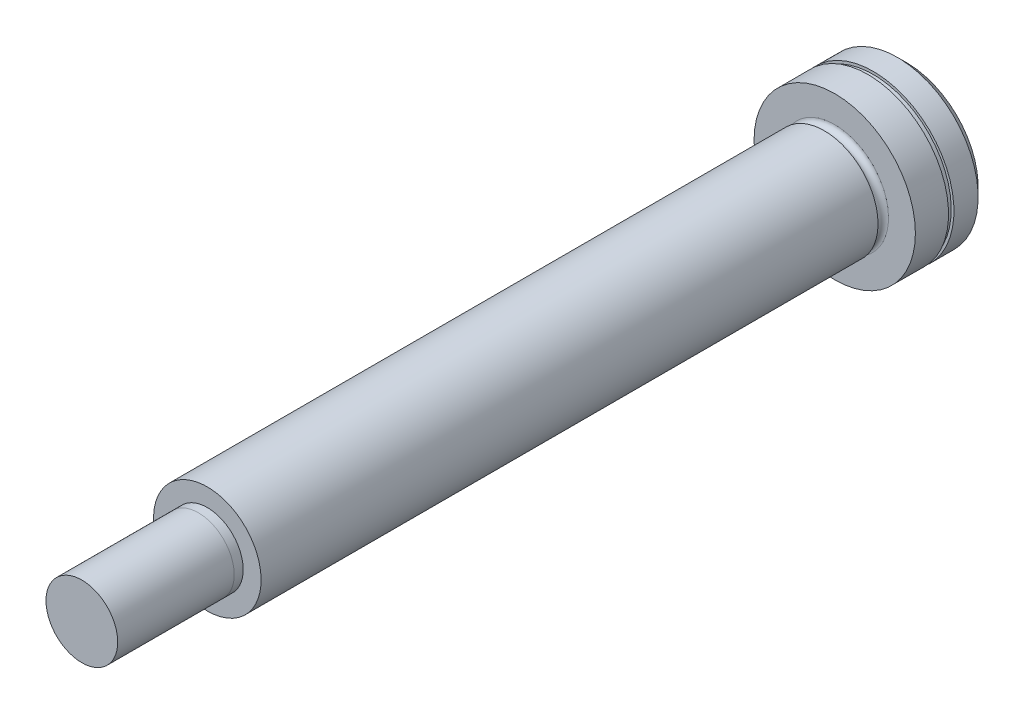
ISO-10303-21;
HEADER;
FILE_DESCRIPTION(('STEP AP214'),'2;1');
FILE_NAME('part.step','',(''),(''),'','','');
FILE_SCHEMA(('AUTOMOTIVE_DESIGN { 1 0 10303 214 1 1 1 1 }'));
ENDSEC;
DATA;
#1=APPLICATION_CONTEXT('core data for automotive mechanical design processes');
#2=APPLICATION_PROTOCOL_DEFINITION('international standard','automotive_design',2000,#1);
#3=PRODUCT_CONTEXT('',#1,'mechanical');
#4=PRODUCT('Part','Part','',(#3));
#5=PRODUCT_RELATED_PRODUCT_CATEGORY('part','',(#4));
#6=PRODUCT_DEFINITION_FORMATION('','',#4);
#7=PRODUCT_DEFINITION_CONTEXT('part definition',#1,'design');
#8=PRODUCT_DEFINITION('design','',#6,#7);
#9=PRODUCT_DEFINITION_SHAPE('','',#8);
#10=(LENGTH_UNIT() NAMED_UNIT(*) SI_UNIT(.MILLI.,.METRE.));
#11=(NAMED_UNIT(*) PLANE_ANGLE_UNIT() SI_UNIT($,.RADIAN.));
#12=(NAMED_UNIT(*) SI_UNIT($,.STERADIAN.) SOLID_ANGLE_UNIT());
#13=UNCERTAINTY_MEASURE_WITH_UNIT(LENGTH_MEASURE(1.E-05),#10,'distance_accuracy_value','');
#14=(GEOMETRIC_REPRESENTATION_CONTEXT(3) GLOBAL_UNCERTAINTY_ASSIGNED_CONTEXT((#13)) GLOBAL_UNIT_ASSIGNED_CONTEXT((#10,
#11,#12)) REPRESENTATION_CONTEXT('',''));
#15=CARTESIAN_POINT('',(0.,0.,0.));
#16=DIRECTION('',(0.,0.,1.));
#17=DIRECTION('',(1.,0.,0.));
#18=AXIS2_PLACEMENT_3D('',#15,#16,#17);
#19=CARTESIAN_POINT('',(0.,0.,0.));
#20=DIRECTION('',(0.,0.,1.));
#21=DIRECTION('',(1.,0.,0.));
#22=AXIS2_PLACEMENT_3D('',#19,#20,#21);
#23=CONICAL_SURFACE('',#22,4.,0.785398163397449);
#24=CARTESIAN_POINT('',(0.,0.,0.));
#25=DIRECTION('',(0.,0.,-1.));
#26=DIRECTION('',(-1.,0.,0.));
#27=AXIS2_PLACEMENT_3D('',#24,#25,#26);
#28=CIRCLE('',#27,4.);
#29=CARTESIAN_POINT('',(-4.,0.,0.));
#30=VERTEX_POINT('',#29);
#31=EDGE_CURVE('E19',#30,#30,#28,.T.);
#32=ORIENTED_EDGE('',*,*,#31,.F.);
#33=EDGE_LOOP('',(#32));
#34=FACE_BOUND('',#33,.T.);
#35=CARTESIAN_POINT('',(0.,0.,0.5));
#36=DIRECTION('',(0.,0.,1.));
#37=DIRECTION('',(-1.,0.,0.));
#38=AXIS2_PLACEMENT_3D('',#35,#36,#37);
#39=CIRCLE('',#38,4.5);
#40=CARTESIAN_POINT('',(-4.5,0.,0.5));
#41=VERTEX_POINT('',#40);
#42=EDGE_CURVE('E10',#41,#41,#39,.T.);
#43=ORIENTED_EDGE('',*,*,#42,.F.);
#44=EDGE_LOOP('',(#43));
#45=FACE_BOUND('',#44,.T.);
#46=ADVANCED_FACE('F15',(#34,#45),#23,.T.);
#47=CARTESIAN_POINT('',(0.,0.,4.));
#48=DIRECTION('',(0.,0.,-1.));
#49=DIRECTION('',(-1.,0.,0.));
#50=AXIS2_PLACEMENT_3D('',#47,#48,#49);
#51=CYLINDRICAL_SURFACE('',#50,4.5);
#52=CARTESIAN_POINT('',(0.,0.,1.85));
#53=DIRECTION('',(0.,0.,1.));
#54=DIRECTION('',(-1.,0.,0.));
#55=AXIS2_PLACEMENT_3D('',#52,#53,#54);
#56=CIRCLE('',#55,4.5);
#57=CARTESIAN_POINT('',(-4.5,0.,1.85));
#58=VERTEX_POINT('',#57);
#59=EDGE_CURVE('E208',#58,#58,#56,.T.);
#60=ORIENTED_EDGE('',*,*,#59,.F.);
#61=EDGE_LOOP('',(#60));
#62=FACE_BOUND('',#61,.T.);
#63=ORIENTED_EDGE('',*,*,#42,.T.);
#64=EDGE_LOOP('',(#63));
#65=FACE_BOUND('',#64,.T.);
#66=ADVANCED_FACE('F325',(#62,#65),#51,.T.);
#67=CARTESIAN_POINT('',(0.,0.,0.));
#68=DIRECTION('',(0.,0.,-1.));
#69=DIRECTION('',(0.,-1.,0.));
#70=AXIS2_PLACEMENT_3D('',#67,#68,#69);
#71=PLANE('',#70);
#72=DIRECTION('',(1.,0.,0.));
#73=VECTOR('',#72,1.);
#74=CARTESIAN_POINT('',(-0.866025403784437,1.5,0.));
#75=LINE('',#74,#73);
#76=CARTESIAN_POINT('',(-0.866025403784437,1.5,0.));
#77=VERTEX_POINT('',#76);
#78=CARTESIAN_POINT('',(0.866025403784438,1.5,0.));
#79=VERTEX_POINT('',#78);
#80=EDGE_CURVE('E260',#77,#79,#75,.T.);
#81=ORIENTED_EDGE('',*,*,#80,.F.);
#82=DIRECTION('',(0.5,0.866025403784438,0.));
#83=VECTOR('',#82,1.);
#84=CARTESIAN_POINT('',(-1.73205080756888,0.,0.));
#85=LINE('',#84,#83);
#86=CARTESIAN_POINT('',(-1.73205080756888,0.,0.));
#87=VERTEX_POINT('',#86);
#88=EDGE_CURVE('E225',#87,#77,#85,.T.);
#89=ORIENTED_EDGE('',*,*,#88,.F.);
#90=DIRECTION('',(-0.5,0.86602540378444,0.));
#91=VECTOR('',#90,1.);
#92=CARTESIAN_POINT('',(-0.866025403784441,-1.5,0.));
#93=LINE('',#92,#91);
#94=CARTESIAN_POINT('',(-0.866025403784441,-1.5,0.));
#95=VERTEX_POINT('',#94);
#96=EDGE_CURVE('E136',#95,#87,#93,.T.);
#97=ORIENTED_EDGE('',*,*,#96,.F.);
#98=DIRECTION('',(-1.,0.,0.));
#99=VECTOR('',#98,1.);
#100=CARTESIAN_POINT('',(0.866025403784438,-1.5,0.));
#101=LINE('',#100,#99);
#102=CARTESIAN_POINT('',(0.866025403784437,-1.5,0.));
#103=VERTEX_POINT('',#102);
#104=EDGE_CURVE('E126',#103,#95,#101,.T.);
#105=ORIENTED_EDGE('',*,*,#104,.F.);
#106=DIRECTION('',(-0.5,-0.866025403784439,0.));
#107=VECTOR('',#106,1.);
#108=CARTESIAN_POINT('',(1.73205080756888,0.,0.));
#109=LINE('',#108,#107);
#110=CARTESIAN_POINT('',(1.73205080756888,0.,0.));
#111=VERTEX_POINT('',#110);
#112=EDGE_CURVE('E132',#111,#103,#109,.T.);
#113=ORIENTED_EDGE('',*,*,#112,.F.);
#114=DIRECTION('',(0.5,-0.866025403784439,0.));
#115=VECTOR('',#114,1.);
#116=CARTESIAN_POINT('',(0.866025403784438,1.5,0.));
#117=LINE('',#116,#115);
#118=EDGE_CURVE('E177',#79,#111,#117,.T.);
#119=ORIENTED_EDGE('',*,*,#118,.F.);
#120=EDGE_LOOP('',(#81,#89,#97,#105,#113,#119));
#121=FACE_BOUND('',#120,.T.);
#122=ORIENTED_EDGE('',*,*,#31,.T.);
#123=EDGE_LOOP('',(#122));
#124=FACE_BOUND('',#123,.T.);
#125=ADVANCED_FACE('F128',(#121,#124),#71,.T.);
#126=CARTESIAN_POINT('',(-0.866025403784437,1.5,2.));
#127=DIRECTION('',(0.,1.,0.));
#128=DIRECTION('',(1.,0.,0.));
#129=AXIS2_PLACEMENT_3D('',#126,#127,#128);
#130=PLANE('',#129);
#131=ORIENTED_EDGE('',*,*,#80,.T.);
#132=DIRECTION('',(0.,0.,-1.));
#133=VECTOR('',#132,1.);
#134=CARTESIAN_POINT('',(0.866025403784438,1.5,2.));
#135=LINE('',#134,#133);
#136=CARTESIAN_POINT('',(0.866025403784438,1.5,2.));
#137=VERTEX_POINT('',#136);
#138=EDGE_CURVE('E159',#137,#79,#135,.T.);
#139=ORIENTED_EDGE('',*,*,#138,.F.);
#140=DIRECTION('',(1.,0.,0.));
#141=VECTOR('',#140,1.);
#142=CARTESIAN_POINT('',(-0.866025403784437,1.5,2.));
#143=LINE('',#142,#141);
#144=CARTESIAN_POINT('',(0.,1.5,2.));
#145=VERTEX_POINT('',#144);
#146=EDGE_CURVE('E171',#145,#137,#143,.T.);
#147=ORIENTED_EDGE('',*,*,#146,.F.);
#148=DIRECTION('',(1.,0.,0.));
#149=VECTOR('',#148,1.);
#150=CARTESIAN_POINT('',(-0.866025403784437,1.5,2.));
#151=LINE('',#150,#149);
#152=CARTESIAN_POINT('',(-0.866025403784437,1.5,2.));
#153=VERTEX_POINT('',#152);
#154=EDGE_CURVE('E175',#153,#145,#151,.T.);
#155=ORIENTED_EDGE('',*,*,#154,.F.);
#156=DIRECTION('',(0.,0.,-1.));
#157=VECTOR('',#156,1.);
#158=CARTESIAN_POINT('',(-0.866025403784437,1.5,2.));
#159=LINE('',#158,#157);
#160=EDGE_CURVE('E229',#153,#77,#159,.T.);
#161=ORIENTED_EDGE('',*,*,#160,.T.);
#162=EDGE_LOOP('',(#131,#139,#147,#155,#161));
#163=FACE_BOUND('',#162,.T.);
#164=ADVANCED_FACE('F352',(#163),#130,.F.);
#165=CARTESIAN_POINT('',(-1.73205080756888,0.,2.));
#166=DIRECTION('',(-0.866025403784438,0.5,0.));
#167=DIRECTION('',(0.,0.,1.));
#168=AXIS2_PLACEMENT_3D('',#165,#166,#167);
#169=PLANE('',#168);
#170=ORIENTED_EDGE('',*,*,#88,.T.);
#171=ORIENTED_EDGE('',*,*,#160,.F.);
#172=DIRECTION('',(0.5,0.866025403784438,0.));
#173=VECTOR('',#172,1.);
#174=CARTESIAN_POINT('',(-1.73205080756888,0.,2.));
#175=LINE('',#174,#173);
#176=CARTESIAN_POINT('',(-1.29903810567666,0.75,2.));
#177=VERTEX_POINT('',#176);
#178=EDGE_CURVE('E224',#177,#153,#175,.T.);
#179=ORIENTED_EDGE('',*,*,#178,.F.);
#180=DIRECTION('',(0.5,0.866025403784438,0.));
#181=VECTOR('',#180,1.);
#182=CARTESIAN_POINT('',(-1.73205080756888,0.,2.));
#183=LINE('',#182,#181);
#184=CARTESIAN_POINT('',(-1.73205080756888,0.,2.));
#185=VERTEX_POINT('',#184);
#186=EDGE_CURVE('E279',#185,#177,#183,.T.);
#187=ORIENTED_EDGE('',*,*,#186,.F.);
#188=DIRECTION('',(0.,0.,-1.));
#189=VECTOR('',#188,1.);
#190=CARTESIAN_POINT('',(-1.73205080756888,0.,2.));
#191=LINE('',#190,#189);
#192=EDGE_CURVE('E193',#185,#87,#191,.T.);
#193=ORIENTED_EDGE('',*,*,#192,.T.);
#194=EDGE_LOOP('',(#170,#171,#179,#187,#193));
#195=FACE_BOUND('',#194,.T.);
#196=ADVANCED_FACE('F345',(#195),#169,.F.);
#197=CARTESIAN_POINT('',(-0.866025403784441,-1.5,2.));
#198=DIRECTION('',(-0.86602540378444,-0.5,0.));
#199=DIRECTION('',(-0.5,0.86602540378444,0.));
#200=AXIS2_PLACEMENT_3D('',#197,#198,#199);
#201=PLANE('',#200);
#202=ORIENTED_EDGE('',*,*,#96,.T.);
#203=ORIENTED_EDGE('',*,*,#192,.F.);
#204=DIRECTION('',(-0.5,0.86602540378444,0.));
#205=VECTOR('',#204,1.);
#206=CARTESIAN_POINT('',(-0.866025403784441,-1.5,2.));
#207=LINE('',#206,#205);
#208=CARTESIAN_POINT('',(-1.29903810567666,-0.75,2.));
#209=VERTEX_POINT('',#208);
#210=EDGE_CURVE('E282',#209,#185,#207,.T.);
#211=ORIENTED_EDGE('',*,*,#210,.F.);
#212=DIRECTION('',(-0.5,0.86602540378444,0.));
#213=VECTOR('',#212,1.);
#214=CARTESIAN_POINT('',(-0.866025403784441,-1.5,2.));
#215=LINE('',#214,#213);
#216=CARTESIAN_POINT('',(-0.866025403784441,-1.5,2.));
#217=VERTEX_POINT('',#216);
#218=EDGE_CURVE('E169',#217,#209,#215,.T.);
#219=ORIENTED_EDGE('',*,*,#218,.F.);
#220=DIRECTION('',(0.,0.,-1.));
#221=VECTOR('',#220,1.);
#222=CARTESIAN_POINT('',(-0.866025403784441,-1.5,2.));
#223=LINE('',#222,#221);
#224=EDGE_CURVE('E140',#217,#95,#223,.T.);
#225=ORIENTED_EDGE('',*,*,#224,.T.);
#226=EDGE_LOOP('',(#202,#203,#211,#219,#225));
#227=FACE_BOUND('',#226,.T.);
#228=ADVANCED_FACE('F342',(#227),#201,.F.);
#229=CARTESIAN_POINT('',(0.866025403784438,-1.5,2.));
#230=DIRECTION('',(0.,-1.,0.));
#231=DIRECTION('',(-1.,0.,0.));
#232=AXIS2_PLACEMENT_3D('',#229,#230,#231);
#233=PLANE('',#232);
#234=ORIENTED_EDGE('',*,*,#104,.T.);
#235=ORIENTED_EDGE('',*,*,#224,.F.);
#236=DIRECTION('',(-1.,0.,0.));
#237=VECTOR('',#236,1.);
#238=CARTESIAN_POINT('',(0.866025403784438,-1.5,2.));
#239=LINE('',#238,#237);
#240=CARTESIAN_POINT('',(0.,-1.5,2.));
#241=VERTEX_POINT('',#240);
#242=EDGE_CURVE('E235',#241,#217,#239,.T.);
#243=ORIENTED_EDGE('',*,*,#242,.F.);
#244=DIRECTION('',(-1.,0.,0.));
#245=VECTOR('',#244,1.);
#246=CARTESIAN_POINT('',(0.866025403784438,-1.5,2.));
#247=LINE('',#246,#245);
#248=CARTESIAN_POINT('',(0.866025403784437,-1.5,2.));
#249=VERTEX_POINT('',#248);
#250=EDGE_CURVE('E148',#249,#241,#247,.T.);
#251=ORIENTED_EDGE('',*,*,#250,.F.);
#252=DIRECTION('',(0.,0.,-1.));
#253=VECTOR('',#252,1.);
#254=CARTESIAN_POINT('',(0.866025403784437,-1.5,2.));
#255=LINE('',#254,#253);
#256=EDGE_CURVE('E141',#249,#103,#255,.T.);
#257=ORIENTED_EDGE('',*,*,#256,.T.);
#258=EDGE_LOOP('',(#234,#235,#243,#251,#257));
#259=FACE_BOUND('',#258,.T.);
#260=ADVANCED_FACE('F145',(#259),#233,.F.);
#261=CARTESIAN_POINT('',(1.73205080756888,0.,2.));
#262=DIRECTION('',(0.866025403784439,-0.5,0.));
#263=DIRECTION('',(0.,0.,-1.));
#264=AXIS2_PLACEMENT_3D('',#261,#262,#263);
#265=PLANE('',#264);
#266=ORIENTED_EDGE('',*,*,#112,.T.);
#267=ORIENTED_EDGE('',*,*,#256,.F.);
#268=DIRECTION('',(-0.5,-0.866025403784439,0.));
#269=VECTOR('',#268,1.);
#270=CARTESIAN_POINT('',(1.73205080756888,0.,2.));
#271=LINE('',#270,#269);
#272=CARTESIAN_POINT('',(1.29903810567666,-0.75,2.));
#273=VERTEX_POINT('',#272);
#274=EDGE_CURVE('E218',#273,#249,#271,.T.);
#275=ORIENTED_EDGE('',*,*,#274,.F.);
#276=DIRECTION('',(-0.5,-0.866025403784439,0.));
#277=VECTOR('',#276,1.);
#278=CARTESIAN_POINT('',(1.73205080756888,0.,2.));
#279=LINE('',#278,#277);
#280=CARTESIAN_POINT('',(1.73205080756888,0.,2.));
#281=VERTEX_POINT('',#280);
#282=EDGE_CURVE('E187',#281,#273,#279,.T.);
#283=ORIENTED_EDGE('',*,*,#282,.F.);
#284=DIRECTION('',(0.,0.,-1.));
#285=VECTOR('',#284,1.);
#286=CARTESIAN_POINT('',(1.73205080756888,0.,2.));
#287=LINE('',#286,#285);
#288=EDGE_CURVE('E156',#281,#111,#287,.T.);
#289=ORIENTED_EDGE('',*,*,#288,.T.);
#290=EDGE_LOOP('',(#266,#267,#275,#283,#289));
#291=FACE_BOUND('',#290,.T.);
#292=ADVANCED_FACE('F154',(#291),#265,.F.);
#293=CARTESIAN_POINT('',(0.866025403784438,1.5,2.));
#294=DIRECTION('',(0.866025403784439,0.5,0.));
#295=DIRECTION('',(0.,0.,-1.));
#296=AXIS2_PLACEMENT_3D('',#293,#294,#295);
#297=PLANE('',#296);
#298=ORIENTED_EDGE('',*,*,#118,.T.);
#299=ORIENTED_EDGE('',*,*,#288,.F.);
#300=DIRECTION('',(0.5,-0.866025403784439,0.));
#301=VECTOR('',#300,1.);
#302=CARTESIAN_POINT('',(0.866025403784438,1.5,2.));
#303=LINE('',#302,#301);
#304=CARTESIAN_POINT('',(1.29903810567666,0.75,2.));
#305=VERTEX_POINT('',#304);
#306=EDGE_CURVE('E183',#305,#281,#303,.T.);
#307=ORIENTED_EDGE('',*,*,#306,.F.);
#308=DIRECTION('',(0.5,-0.866025403784439,0.));
#309=VECTOR('',#308,1.);
#310=CARTESIAN_POINT('',(0.866025403784438,1.5,2.));
#311=LINE('',#310,#309);
#312=EDGE_CURVE('E174',#137,#305,#311,.T.);
#313=ORIENTED_EDGE('',*,*,#312,.F.);
#314=ORIENTED_EDGE('',*,*,#138,.T.);
#315=EDGE_LOOP('',(#298,#299,#307,#313,#314));
#316=FACE_BOUND('',#315,.T.);
#317=ADVANCED_FACE('F350',(#316),#297,.F.);
#318=CARTESIAN_POINT('',(0.,0.,2.));
#319=DIRECTION('',(0.,0.,-1.));
#320=DIRECTION('',(0.,-1.,0.));
#321=AXIS2_PLACEMENT_3D('',#318,#319,#320);
#322=PLANE('',#321);
#323=CARTESIAN_POINT('',(0.,0.,2.));
#324=DIRECTION('',(0.,0.,-1.));
#325=DIRECTION('',(-1.,0.,0.));
#326=AXIS2_PLACEMENT_3D('',#323,#324,#325);
#327=CIRCLE('',#326,1.5);
#328=EDGE_CURVE('E203',#145,#305,#327,.T.);
#329=ORIENTED_EDGE('',*,*,#328,.F.);
#330=ORIENTED_EDGE('',*,*,#146,.T.);
#331=ORIENTED_EDGE('',*,*,#312,.T.);
#332=EDGE_LOOP('',(#329,#330,#331));
#333=FACE_BOUND('',#332,.T.);
#334=ADVANCED_FACE('F347',(#333),#322,.T.);
#335=CARTESIAN_POINT('',(0.,0.,2.));
#336=DIRECTION('',(0.,0.,-1.));
#337=DIRECTION('',(0.,-1.,0.));
#338=AXIS2_PLACEMENT_3D('',#335,#336,#337);
#339=PLANE('',#338);
#340=CARTESIAN_POINT('',(0.,0.,2.));
#341=DIRECTION('',(0.,0.,-1.));
#342=DIRECTION('',(-1.,0.,0.));
#343=AXIS2_PLACEMENT_3D('',#340,#341,#342);
#344=CIRCLE('',#343,1.5);
#345=EDGE_CURVE('E199',#177,#145,#344,.T.);
#346=ORIENTED_EDGE('',*,*,#345,.F.);
#347=ORIENTED_EDGE('',*,*,#178,.T.);
#348=ORIENTED_EDGE('',*,*,#154,.T.);
#349=EDGE_LOOP('',(#346,#347,#348));
#350=FACE_BOUND('',#349,.T.);
#351=ADVANCED_FACE('F349',(#350),#339,.T.);
#352=CARTESIAN_POINT('',(0.,0.,2.));
#353=DIRECTION('',(0.,0.,-1.));
#354=DIRECTION('',(0.,-1.,0.));
#355=AXIS2_PLACEMENT_3D('',#352,#353,#354);
#356=PLANE('',#355);
#357=CARTESIAN_POINT('',(0.,0.,2.));
#358=DIRECTION('',(0.,0.,-1.));
#359=DIRECTION('',(-1.,0.,0.));
#360=AXIS2_PLACEMENT_3D('',#357,#358,#359);
#361=CIRCLE('',#360,1.5);
#362=EDGE_CURVE('E204',#209,#177,#361,.T.);
#363=ORIENTED_EDGE('',*,*,#362,.F.);
#364=ORIENTED_EDGE('',*,*,#210,.T.);
#365=ORIENTED_EDGE('',*,*,#186,.T.);
#366=EDGE_LOOP('',(#363,#364,#365));
#367=FACE_BOUND('',#366,.T.);
#368=ADVANCED_FACE('F475',(#367),#356,.T.);
#369=CARTESIAN_POINT('',(0.,0.,2.));
#370=DIRECTION('',(0.,0.,-1.));
#371=DIRECTION('',(0.,-1.,0.));
#372=AXIS2_PLACEMENT_3D('',#369,#370,#371);
#373=PLANE('',#372);
#374=CARTESIAN_POINT('',(0.,0.,2.));
#375=DIRECTION('',(0.,0.,-1.));
#376=DIRECTION('',(-1.,0.,0.));
#377=AXIS2_PLACEMENT_3D('',#374,#375,#376);
#378=CIRCLE('',#377,1.5);
#379=EDGE_CURVE('E217',#241,#209,#378,.T.);
#380=ORIENTED_EDGE('',*,*,#379,.F.);
#381=ORIENTED_EDGE('',*,*,#242,.T.);
#382=ORIENTED_EDGE('',*,*,#218,.T.);
#383=EDGE_LOOP('',(#380,#381,#382));
#384=FACE_BOUND('',#383,.T.);
#385=ADVANCED_FACE('F472',(#384),#373,.T.);
#386=CARTESIAN_POINT('',(0.,0.,2.));
#387=DIRECTION('',(0.,0.,-1.));
#388=DIRECTION('',(0.,-1.,0.));
#389=AXIS2_PLACEMENT_3D('',#386,#387,#388);
#390=PLANE('',#389);
#391=CARTESIAN_POINT('',(0.,0.,2.));
#392=DIRECTION('',(0.,0.,1.));
#393=DIRECTION('',(0.,-1.,0.));
#394=AXIS2_PLACEMENT_3D('',#391,#392,#393);
#395=CIRCLE('',#394,1.5);
#396=EDGE_CURVE('E213',#241,#273,#395,.T.);
#397=ORIENTED_EDGE('',*,*,#396,.T.);
#398=ORIENTED_EDGE('',*,*,#274,.T.);
#399=ORIENTED_EDGE('',*,*,#250,.T.);
#400=EDGE_LOOP('',(#397,#398,#399));
#401=FACE_BOUND('',#400,.T.);
#402=ADVANCED_FACE('F340',(#401),#390,.T.);
#403=CARTESIAN_POINT('',(0.,0.,2.));
#404=DIRECTION('',(0.,0.,-1.));
#405=DIRECTION('',(0.,-1.,0.));
#406=AXIS2_PLACEMENT_3D('',#403,#404,#405);
#407=PLANE('',#406);
#408=CARTESIAN_POINT('',(0.,0.,2.));
#409=DIRECTION('',(0.,0.,-1.));
#410=DIRECTION('',(-1.,0.,0.));
#411=AXIS2_PLACEMENT_3D('',#408,#409,#410);
#412=CIRCLE('',#411,1.5);
#413=EDGE_CURVE('E188',#305,#273,#412,.T.);
#414=ORIENTED_EDGE('',*,*,#413,.F.);
#415=ORIENTED_EDGE('',*,*,#306,.T.);
#416=ORIENTED_EDGE('',*,*,#282,.T.);
#417=EDGE_LOOP('',(#414,#415,#416));
#418=FACE_BOUND('',#417,.T.);
#419=ADVANCED_FACE('F319',(#418),#407,.T.);
#420=CARTESIAN_POINT('',(0.,0.,2.));
#421=DIRECTION('',(0.,0.,-1.));
#422=DIRECTION('',(0.,-1.,0.));
#423=AXIS2_PLACEMENT_3D('',#420,#421,#422);
#424=CONICAL_SURFACE('',#423,1.5,1.02974425867665);
#425=CARTESIAN_POINT('',(0.,0.,2.90129092854134));
#426=VERTEX_POINT('',#425);
#427=VERTEX_LOOP('',#426);
#428=FACE_BOUND('',#427,.T.);
#429=ORIENTED_EDGE('',*,*,#396,.F.);
#430=ORIENTED_EDGE('',*,*,#379,.T.);
#431=ORIENTED_EDGE('',*,*,#362,.T.);
#432=ORIENTED_EDGE('',*,*,#345,.T.);
#433=ORIENTED_EDGE('',*,*,#328,.T.);
#434=ORIENTED_EDGE('',*,*,#413,.T.);
#435=EDGE_LOOP('',(#429,#430,#431,#432,#433,#434));
#436=FACE_BOUND('',#435,.T.);
#437=ADVANCED_FACE('F308',(#428,#436),#424,.F.);
#438=CARTESIAN_POINT('',(0.,-2.175,2.15));
#439=DIRECTION('',(0.,0.,-1.));
#440=DIRECTION('',(0.,-1.,0.));
#441=AXIS2_PLACEMENT_3D('',#438,#439,#440);
#442=PLANE('',#441);
#443=CARTESIAN_POINT('',(0.,0.,2.15));
#444=DIRECTION('',(0.,0.,1.));
#445=DIRECTION('',(0.,-1.,0.));
#446=AXIS2_PLACEMENT_3D('',#443,#444,#445);
#447=CIRCLE('',#446,4.35);
#448=CARTESIAN_POINT('',(0.,-4.35,2.15));
#449=VERTEX_POINT('',#448);
#450=EDGE_CURVE('E205',#449,#449,#447,.T.);
#451=ORIENTED_EDGE('',*,*,#450,.T.);
#452=EDGE_LOOP('',(#451));
#453=FACE_BOUND('',#452,.T.);
#454=CARTESIAN_POINT('',(0.,0.,2.15));
#455=DIRECTION('',(0.,0.,1.));
#456=DIRECTION('',(-1.,0.,0.));
#457=AXIS2_PLACEMENT_3D('',#454,#455,#456);
#458=CIRCLE('',#457,4.5);
#459=CARTESIAN_POINT('',(-4.5,0.,2.15));
#460=VERTEX_POINT('',#459);
#461=EDGE_CURVE('E182',#460,#460,#458,.T.);
#462=ORIENTED_EDGE('',*,*,#461,.F.);
#463=EDGE_LOOP('',(#462));
#464=FACE_BOUND('',#463,.T.);
#465=ADVANCED_FACE('F305',(#453,#464),#442,.T.);
#466=CARTESIAN_POINT('',(0.,-2.175,1.85));
#467=DIRECTION('',(0.,0.,-1.));
#468=DIRECTION('',(0.,-1.,0.));
#469=AXIS2_PLACEMENT_3D('',#466,#467,#468);
#470=PLANE('',#469);
#471=CARTESIAN_POINT('',(0.,0.,1.85));
#472=DIRECTION('',(0.,0.,1.));
#473=DIRECTION('',(0.,-1.,0.));
#474=AXIS2_PLACEMENT_3D('',#471,#472,#473);
#475=CIRCLE('',#474,4.35);
#476=CARTESIAN_POINT('',(0.,-4.35,1.85));
#477=VERTEX_POINT('',#476);
#478=EDGE_CURVE('E209',#477,#477,#475,.T.);
#479=ORIENTED_EDGE('',*,*,#478,.F.);
#480=EDGE_LOOP('',(#479));
#481=FACE_BOUND('',#480,.T.);
#482=ORIENTED_EDGE('',*,*,#59,.T.);
#483=EDGE_LOOP('',(#482));
#484=FACE_BOUND('',#483,.T.);
#485=ADVANCED_FACE('F307',(#481,#484),#470,.F.);
#486=CARTESIAN_POINT('',(0.,0.,1.85));
#487=DIRECTION('',(0.,0.,1.));
#488=DIRECTION('',(1.,0.,0.));
#489=AXIS2_PLACEMENT_3D('',#486,#487,#488);
#490=CYLINDRICAL_SURFACE('',#489,4.35);
#491=ORIENTED_EDGE('',*,*,#450,.F.);
#492=EDGE_LOOP('',(#491));
#493=FACE_BOUND('',#492,.T.);
#494=ORIENTED_EDGE('',*,*,#478,.T.);
#495=EDGE_LOOP('',(#494));
#496=FACE_BOUND('',#495,.T.);
#497=ADVANCED_FACE('F316',(#493,#496),#490,.T.);
#498=CARTESIAN_POINT('',(0.,0.,39.));
#499=DIRECTION('',(0.,0.,-1.));
#500=DIRECTION('',(-1.,0.,0.));
#501=AXIS2_PLACEMENT_3D('',#498,#499,#500);
#502=CYLINDRICAL_SURFACE('',#501,3.);
#503=CARTESIAN_POINT('',(0.,0.,4.58413056717129));
#504=DIRECTION('',(0.,0.,1.));
#505=DIRECTION('',(1.,0.,0.));
#506=AXIS2_PLACEMENT_3D('',#503,#504,#505);
#507=CIRCLE('',#506,3.);
#508=CARTESIAN_POINT('',(3.,0.,4.58413056717129));
#509=VERTEX_POINT('',#508);
#510=EDGE_CURVE('E246',#509,#509,#507,.T.);
#511=ORIENTED_EDGE('',*,*,#510,.T.);
#512=EDGE_LOOP('',(#511));
#513=FACE_BOUND('',#512,.T.);
#514=CARTESIAN_POINT('',(0.,0.,39.));
#515=DIRECTION('',(0.,0.,-1.));
#516=DIRECTION('',(0.,-1.,0.));
#517=AXIS2_PLACEMENT_3D('',#514,#515,#516);
#518=CIRCLE('',#517,3.);
#519=CARTESIAN_POINT('',(0.,-3.,39.));
#520=VERTEX_POINT('',#519);
#521=EDGE_CURVE('E242',#520,#520,#518,.T.);
#522=ORIENTED_EDGE('',*,*,#521,.T.);
#523=EDGE_LOOP('',(#522));
#524=FACE_BOUND('',#523,.T.);
#525=ADVANCED_FACE('F511',(#513,#524),#502,.T.);
#526=CARTESIAN_POINT('',(0.,0.,39.));
#527=DIRECTION('',(0.,0.,-1.));
#528=DIRECTION('',(0.,-1.,0.));
#529=AXIS2_PLACEMENT_3D('',#526,#527,#528);
#530=PLANE('',#529);
#531=ORIENTED_EDGE('',*,*,#521,.F.);
#532=EDGE_LOOP('',(#531));
#533=FACE_BOUND('',#532,.T.);
#534=CARTESIAN_POINT('',(0.,0.,39.));
#535=DIRECTION('',(0.,0.,-1.));
#536=DIRECTION('',(0.,-1.,0.));
#537=AXIS2_PLACEMENT_3D('',#534,#535,#536);
#538=CIRCLE('',#537,2.);
#539=CARTESIAN_POINT('',(0.,-2.,39.));
#540=VERTEX_POINT('',#539);
#541=EDGE_CURVE('E251',#540,#540,#538,.T.);
#542=ORIENTED_EDGE('',*,*,#541,.T.);
#543=EDGE_LOOP('',(#542));
#544=FACE_BOUND('',#543,.T.);
#545=ADVANCED_FACE('F430',(#533,#544),#530,.F.);
#546=CARTESIAN_POINT('',(0.,0.,46.));
#547=DIRECTION('',(0.,0.,-1.));
#548=DIRECTION('',(-1.,0.,0.));
#549=AXIS2_PLACEMENT_3D('',#546,#547,#548);
#550=CYLINDRICAL_SURFACE('',#549,2.);
#551=ORIENTED_EDGE('',*,*,#541,.F.);
#552=EDGE_LOOP('',(#551));
#553=FACE_BOUND('',#552,.T.);
#554=CARTESIAN_POINT('',(0.,0.,39.5));
#555=DIRECTION('',(0.,0.,1.));
#556=DIRECTION('',(-1.,0.,0.));
#557=AXIS2_PLACEMENT_3D('',#554,#555,#556);
#558=CIRCLE('',#557,2.);
#559=CARTESIAN_POINT('',(-2.,0.,39.5));
#560=VERTEX_POINT('',#559);
#561=EDGE_CURVE('E254',#560,#560,#558,.T.);
#562=ORIENTED_EDGE('',*,*,#561,.F.);
#563=EDGE_LOOP('',(#562));
#564=FACE_BOUND('',#563,.T.);
#565=ADVANCED_FACE('F17',(#553,#564),#550,.T.);
#566=CARTESIAN_POINT('',(0.,0.,46.));
#567=DIRECTION('',(0.,0.,-1.));
#568=DIRECTION('',(-1.,0.,0.));
#569=AXIS2_PLACEMENT_3D('',#566,#567,#568);
#570=CYLINDRICAL_SURFACE('',#569,2.);
#571=ORIENTED_EDGE('',*,*,#561,.T.);
#572=EDGE_LOOP('',(#571));
#573=FACE_BOUND('',#572,.T.);
#574=CARTESIAN_POINT('',(0.,0.,46.));
#575=DIRECTION('',(0.,0.,-1.));
#576=DIRECTION('',(0.,-1.,0.));
#577=AXIS2_PLACEMENT_3D('',#574,#575,#576);
#578=CIRCLE('',#577,2.);
#579=CARTESIAN_POINT('',(0.,-2.,46.));
#580=VERTEX_POINT('',#579);
#581=EDGE_CURVE('E249',#580,#580,#578,.T.);
#582=ORIENTED_EDGE('',*,*,#581,.T.);
#583=EDGE_LOOP('',(#582));
#584=FACE_BOUND('',#583,.T.);
#585=ADVANCED_FACE('F429',(#573,#584),#570,.T.);
#586=CARTESIAN_POINT('',(0.,0.,46.));
#587=DIRECTION('',(0.,0.,-1.));
#588=DIRECTION('',(0.,-1.,0.));
#589=AXIS2_PLACEMENT_3D('',#586,#587,#588);
#590=PLANE('',#589);
#591=ORIENTED_EDGE('',*,*,#581,.F.);
#592=EDGE_LOOP('',(#591));
#593=FACE_BOUND('',#592,.T.);
#594=ADVANCED_FACE('F501',(#593),#590,.F.);
#595=CARTESIAN_POINT('',(0.,0.,4.29206528358564));
#596=DIRECTION('',(0.,0.,1.));
#597=DIRECTION('',(1.,0.,0.));
#598=AXIS2_PLACEMENT_3D('',#595,#596,#597);
#599=TOROIDAL_SURFACE('',#598,3.,0.292065283585645);
#600=ORIENTED_EDGE('',*,*,#510,.F.);
#601=EDGE_LOOP('',(#600));
#602=FACE_BOUND('',#601,.T.);
#603=CARTESIAN_POINT('',(0.,0.,4.));
#604=DIRECTION('',(0.,0.,-1.));
#605=DIRECTION('',(0.,-1.,0.));
#606=AXIS2_PLACEMENT_3D('',#603,#604,#605);
#607=CIRCLE('',#606,3.);
#608=CARTESIAN_POINT('',(0.,-3.,4.));
#609=VERTEX_POINT('',#608);
#610=EDGE_CURVE('E250',#609,#609,#607,.T.);
#611=ORIENTED_EDGE('',*,*,#610,.F.);
#612=EDGE_LOOP('',(#611));
#613=FACE_BOUND('',#612,.T.);
#614=ADVANCED_FACE('F497',(#602,#613),#599,.F.);
#615=CARTESIAN_POINT('',(0.,0.,4.));
#616=DIRECTION('',(0.,0.,-1.));
#617=DIRECTION('',(0.,-1.,0.));
#618=AXIS2_PLACEMENT_3D('',#615,#616,#617);
#619=PLANE('',#618);
#620=CARTESIAN_POINT('',(0.,0.,4.));
#621=DIRECTION('',(0.,0.,-1.));
#622=DIRECTION('',(1.,0.,0.));
#623=AXIS2_PLACEMENT_3D('',#620,#621,#622);
#624=CIRCLE('',#623,4.5);
#625=CARTESIAN_POINT('',(4.5,0.,4.));
#626=VERTEX_POINT('',#625);
#627=EDGE_CURVE('E179',#626,#626,#624,.T.);
#628=ORIENTED_EDGE('',*,*,#627,.F.);
#629=EDGE_LOOP('',(#628));
#630=FACE_BOUND('',#629,.T.);
#631=ORIENTED_EDGE('',*,*,#610,.T.);
#632=EDGE_LOOP('',(#631));
#633=FACE_BOUND('',#632,.T.);
#634=ADVANCED_FACE('F494',(#630,#633),#619,.F.);
#635=CARTESIAN_POINT('',(0.,0.,4.));
#636=DIRECTION('',(0.,0.,-1.));
#637=DIRECTION('',(-1.,0.,0.));
#638=AXIS2_PLACEMENT_3D('',#635,#636,#637);
#639=CYLINDRICAL_SURFACE('',#638,4.5);
#640=ORIENTED_EDGE('',*,*,#461,.T.);
#641=EDGE_LOOP('',(#640));
#642=FACE_BOUND('',#641,.T.);
#643=ORIENTED_EDGE('',*,*,#627,.T.);
#644=EDGE_LOOP('',(#643));
#645=FACE_BOUND('',#644,.T.);
#646=ADVANCED_FACE('F302',(#642,#645),#639,.T.);
#647=CLOSED_SHELL('',(#46,#66,#125,#164,#196,#228,#260,#292,#317,#334,#351,#368,#385,#402,#419,
#437,#465,#485,#497,#525,#545,#565,#585,#594,#614,#634,#646));
#648=MANIFOLD_SOLID_BREP('B1',#647);
#649=ADVANCED_BREP_SHAPE_REPRESENTATION('',(#18,#648),#14);
#650=SHAPE_DEFINITION_REPRESENTATION(#9,#649);
ENDSEC;
END-ISO-10303-21;
